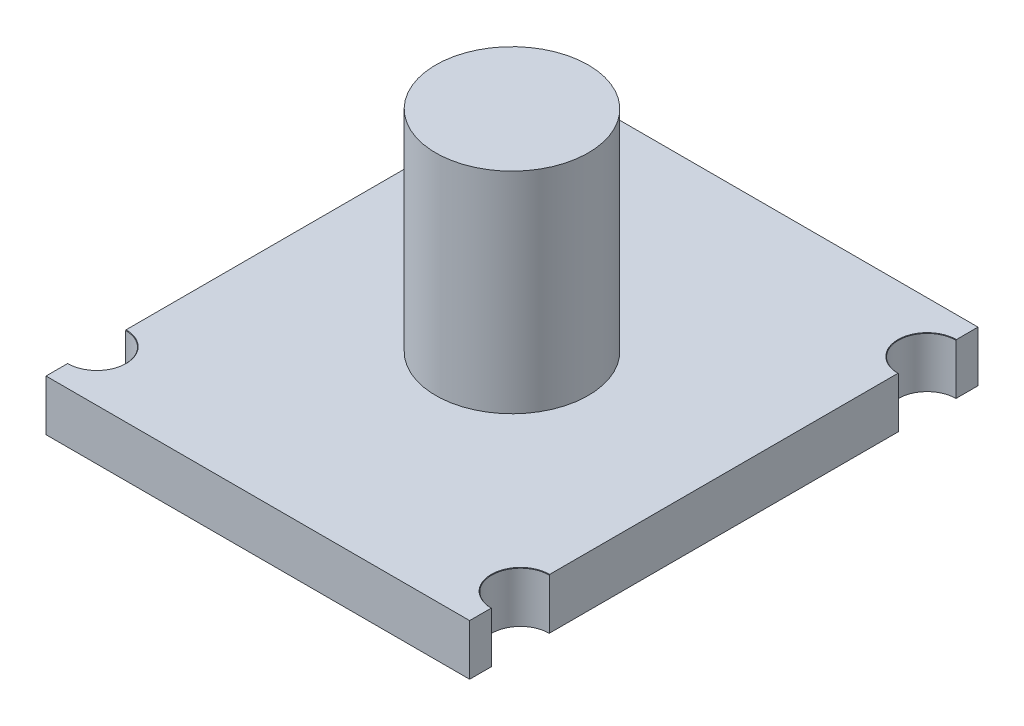
ISO-10303-21;
HEADER;
FILE_DESCRIPTION(('STEP AP214'),'2;1');
FILE_NAME('part.step','',(''),(''),'','','');
FILE_SCHEMA(('AUTOMOTIVE_DESIGN { 1 0 10303 214 1 1 1 1 }'));
ENDSEC;
DATA;
#1=APPLICATION_CONTEXT('core data for automotive mechanical design processes');
#2=APPLICATION_PROTOCOL_DEFINITION('international standard','automotive_design',2000,#1);
#3=PRODUCT_CONTEXT('',#1,'mechanical');
#4=PRODUCT('Part','Part','',(#3));
#5=PRODUCT_RELATED_PRODUCT_CATEGORY('part','',(#4));
#6=PRODUCT_DEFINITION_FORMATION('','',#4);
#7=PRODUCT_DEFINITION_CONTEXT('part definition',#1,'design');
#8=PRODUCT_DEFINITION('design','',#6,#7);
#9=PRODUCT_DEFINITION_SHAPE('','',#8);
#10=(LENGTH_UNIT() NAMED_UNIT(*) SI_UNIT(.MILLI.,.METRE.));
#11=(NAMED_UNIT(*) PLANE_ANGLE_UNIT() SI_UNIT($,.RADIAN.));
#12=(NAMED_UNIT(*) SI_UNIT($,.STERADIAN.) SOLID_ANGLE_UNIT());
#13=UNCERTAINTY_MEASURE_WITH_UNIT(LENGTH_MEASURE(1.E-05),#10,'distance_accuracy_value','');
#14=(GEOMETRIC_REPRESENTATION_CONTEXT(3) GLOBAL_UNCERTAINTY_ASSIGNED_CONTEXT((#13)) GLOBAL_UNIT_ASSIGNED_CONTEXT((#10,
#11,#12)) REPRESENTATION_CONTEXT('',''));
#15=CARTESIAN_POINT('',(0.,0.,0.));
#16=DIRECTION('',(0.,0.,1.));
#17=DIRECTION('',(1.,0.,0.));
#18=AXIS2_PLACEMENT_3D('',#15,#16,#17);
#19=CARTESIAN_POINT('',(0.,3.,0.));
#20=DIRECTION('',(1.,0.,0.));
#21=DIRECTION('',(0.,0.,-1.));
#22=AXIS2_PLACEMENT_3D('',#19,#20,#21);
#23=PLANE('',#22);
#24=DIRECTION('',(0.,0.,1.));
#25=VECTOR('',#24,1.);
#26=CARTESIAN_POINT('',(0.,0.,0.));
#27=LINE('',#26,#25);
#28=CARTESIAN_POINT('',(0.,0.,-25.3));
#29=VERTEX_POINT('',#28);
#30=CARTESIAN_POINT('',(0.,0.,-21.));
#31=VERTEX_POINT('',#30);
#32=EDGE_CURVE('E202',#29,#31,#27,.T.);
#33=ORIENTED_EDGE('',*,*,#32,.T.);
#34=DIRECTION('',(0.,1.,0.));
#35=VECTOR('',#34,1.);
#36=CARTESIAN_POINT('',(0.,-6.,-21.));
#37=LINE('',#36,#35);
#38=CARTESIAN_POINT('',(0.,-6.,-21.));
#39=VERTEX_POINT('',#38);
#40=EDGE_CURVE('E181',#39,#31,#37,.T.);
#41=ORIENTED_EDGE('',*,*,#40,.F.);
#42=DIRECTION('',(0.,0.,-1.));
#43=VECTOR('',#42,1.);
#44=CARTESIAN_POINT('',(0.,-6.,-9.));
#45=LINE('',#44,#43);
#46=CARTESIAN_POINT('',(0.,-6.,-9.));
#47=VERTEX_POINT('',#46);
#48=EDGE_CURVE('E188',#47,#39,#45,.T.);
#49=ORIENTED_EDGE('',*,*,#48,.F.);
#50=DIRECTION('',(0.,1.,0.));
#51=VECTOR('',#50,1.);
#52=CARTESIAN_POINT('',(0.,-6.,-9.));
#53=LINE('',#52,#51);
#54=CARTESIAN_POINT('',(0.,0.,-9.));
#55=VERTEX_POINT('',#54);
#56=EDGE_CURVE('E641',#47,#55,#53,.T.);
#57=ORIENTED_EDGE('',*,*,#56,.T.);
#58=CARTESIAN_POINT('',(0.,0.,-4.7));
#59=VERTEX_POINT('',#58);
#60=EDGE_CURVE('E61',#55,#59,#27,.T.);
#61=ORIENTED_EDGE('',*,*,#60,.T.);
#62=DIRECTION('',(0.,1.,0.));
#63=VECTOR('',#62,1.);
#64=CARTESIAN_POINT('',(0.,3.,-4.7));
#65=LINE('',#64,#63);
#66=CARTESIAN_POINT('',(0.,2.975,-4.7));
#67=VERTEX_POINT('',#66);
#68=EDGE_CURVE('E43',#59,#67,#65,.T.);
#69=ORIENTED_EDGE('',*,*,#68,.T.);
#70=DIRECTION('',(0.,0.707106781186563,-0.707106781186532));
#71=VECTOR('',#70,1.);
#72=CARTESIAN_POINT('',(0.,1.27499999999993,-3.));
#73=LINE('',#72,#71);
#74=CARTESIAN_POINT('',(0.,3.,-4.725));
#75=VERTEX_POINT('',#74);
#76=EDGE_CURVE('E363',#67,#75,#73,.T.);
#77=ORIENTED_EDGE('',*,*,#76,.T.);
#78=DIRECTION('',(0.,0.,1.));
#79=VECTOR('',#78,1.);
#80=CARTESIAN_POINT('',(0.,3.,0.));
#81=LINE('',#80,#79);
#82=CARTESIAN_POINT('',(0.,3.,-25.275));
#83=VERTEX_POINT('',#82);
#84=EDGE_CURVE('E266',#83,#75,#81,.T.);
#85=ORIENTED_EDGE('',*,*,#84,.F.);
#86=DIRECTION('',(0.,-0.707106781186563,-0.707106781186532));
#87=VECTOR('',#86,1.);
#88=CARTESIAN_POINT('',(0.,1.27499999999993,-27.));
#89=LINE('',#88,#87);
#90=CARTESIAN_POINT('',(0.,2.975,-25.3));
#91=VERTEX_POINT('',#90);
#92=EDGE_CURVE('E341',#83,#91,#89,.T.);
#93=ORIENTED_EDGE('',*,*,#92,.T.);
#94=DIRECTION('',(0.,1.,0.));
#95=VECTOR('',#94,1.);
#96=CARTESIAN_POINT('',(0.,3.,-25.3));
#97=LINE('',#96,#95);
#98=EDGE_CURVE('E345',#91,#29,#97,.F.);
#99=ORIENTED_EDGE('',*,*,#98,.T.);
#100=EDGE_LOOP('',(#33,#41,#49,#57,#61,#69,#77,#85,#93,#99));
#101=FACE_BOUND('',#100,.T.);
#102=ADVANCED_FACE('F39',(#101),#23,.F.);
#103=CARTESIAN_POINT('',(0.,3.,0.));
#104=DIRECTION('',(0.,-1.,0.));
#105=DIRECTION('',(0.,0.,-1.));
#106=AXIS2_PLACEMENT_3D('',#103,#104,#105);
#107=PLANE('',#106);
#108=CARTESIAN_POINT('',(12.5,3.,-15.));
#109=DIRECTION('',(0.,1.,0.));
#110=DIRECTION('',(0.,0.,1.));
#111=AXIS2_PLACEMENT_3D('',#108,#109,#110);
#112=CIRCLE('',#111,4.5);
#113=CARTESIAN_POINT('',(12.5,3.,-19.5));
#114=VERTEX_POINT('',#113);
#115=EDGE_CURVE('E11',#114,#114,#112,.T.);
#116=ORIENTED_EDGE('',*,*,#115,.F.);
#117=EDGE_LOOP('',(#116));
#118=FACE_BOUND('',#117,.T.);
#119=ORIENTED_EDGE('',*,*,#84,.T.);
#120=CARTESIAN_POINT('',(0.,3.,-3.));
#121=DIRECTION('',(0.,1.,0.));
#122=DIRECTION('',(0.,0.,1.));
#123=AXIS2_PLACEMENT_3D('',#120,#121,#122);
#124=CIRCLE('',#123,1.725);
#125=CARTESIAN_POINT('',(0.,3.,-1.275));
#126=VERTEX_POINT('',#125);
#127=EDGE_CURVE('E209',#126,#75,#124,.T.);
#128=ORIENTED_EDGE('',*,*,#127,.F.);
#129=CARTESIAN_POINT('',(0.,3.,0.));
#130=VERTEX_POINT('',#129);
#131=EDGE_CURVE('E267',#126,#130,#81,.T.);
#132=ORIENTED_EDGE('',*,*,#131,.T.);
#133=DIRECTION('',(1.,0.,0.));
#134=VECTOR('',#133,1.);
#135=CARTESIAN_POINT('',(0.,3.,0.));
#136=LINE('',#135,#134);
#137=CARTESIAN_POINT('',(25.,3.,0.));
#138=VERTEX_POINT('',#137);
#139=EDGE_CURVE('E265',#130,#138,#136,.T.);
#140=ORIENTED_EDGE('',*,*,#139,.T.);
#141=DIRECTION('',(0.,0.,-1.));
#142=VECTOR('',#141,1.);
#143=CARTESIAN_POINT('',(25.,3.,0.));
#144=LINE('',#143,#142);
#145=CARTESIAN_POINT('',(25.,3.,-1.275));
#146=VERTEX_POINT('',#145);
#147=EDGE_CURVE('E271',#138,#146,#144,.T.);
#148=ORIENTED_EDGE('',*,*,#147,.T.);
#149=CARTESIAN_POINT('',(25.,3.,-3.));
#150=DIRECTION('',(0.,1.,0.));
#151=DIRECTION('',(0.,0.,1.));
#152=AXIS2_PLACEMENT_3D('',#149,#150,#151);
#153=CIRCLE('',#152,1.725);
#154=CARTESIAN_POINT('',(25.,3.,-4.725));
#155=VERTEX_POINT('',#154);
#156=EDGE_CURVE('E235',#155,#146,#153,.T.);
#157=ORIENTED_EDGE('',*,*,#156,.F.);
#158=CARTESIAN_POINT('',(25.,3.,-25.275));
#159=VERTEX_POINT('',#158);
#160=EDGE_CURVE('E276',#155,#159,#144,.T.);
#161=ORIENTED_EDGE('',*,*,#160,.T.);
#162=CARTESIAN_POINT('',(25.,3.,-27.));
#163=DIRECTION('',(0.,1.,0.));
#164=DIRECTION('',(0.,0.,1.));
#165=AXIS2_PLACEMENT_3D('',#162,#163,#164);
#166=CIRCLE('',#165,1.725);
#167=CARTESIAN_POINT('',(25.,3.,-28.725));
#168=VERTEX_POINT('',#167);
#169=EDGE_CURVE('E246',#168,#159,#166,.T.);
#170=ORIENTED_EDGE('',*,*,#169,.F.);
#171=CARTESIAN_POINT('',(25.,3.,-30.));
#172=VERTEX_POINT('',#171);
#173=EDGE_CURVE('E270',#168,#172,#144,.T.);
#174=ORIENTED_EDGE('',*,*,#173,.T.);
#175=DIRECTION('',(-1.,0.,0.));
#176=VECTOR('',#175,1.);
#177=CARTESIAN_POINT('',(0.,3.,-30.));
#178=LINE('',#177,#176);
#179=CARTESIAN_POINT('',(0.,3.,-30.));
#180=VERTEX_POINT('',#179);
#181=EDGE_CURVE('E275',#172,#180,#178,.T.);
#182=ORIENTED_EDGE('',*,*,#181,.T.);
#183=CARTESIAN_POINT('',(0.,3.,-28.725));
#184=VERTEX_POINT('',#183);
#185=EDGE_CURVE('E261',#180,#184,#81,.T.);
#186=ORIENTED_EDGE('',*,*,#185,.T.);
#187=CARTESIAN_POINT('',(0.,3.,-27.));
#188=DIRECTION('',(0.,1.,0.));
#189=DIRECTION('',(0.,0.,1.));
#190=AXIS2_PLACEMENT_3D('',#187,#188,#189);
#191=CIRCLE('',#190,1.725);
#192=EDGE_CURVE('E224',#83,#184,#191,.T.);
#193=ORIENTED_EDGE('',*,*,#192,.F.);
#194=EDGE_LOOP('',(#119,#128,#132,#140,#148,#157,#161,#170,#174,#182,#186,#193));
#195=FACE_BOUND('',#194,.T.);
#196=ADVANCED_FACE('F393',(#118,#195),#107,.F.);
#197=CARTESIAN_POINT('',(0.,0.,-30.));
#198=VERTEX_POINT('',#197);
#199=CARTESIAN_POINT('',(0.,0.,-28.7));
#200=VERTEX_POINT('',#199);
#201=EDGE_CURVE('E280',#198,#200,#27,.T.);
#202=ORIENTED_EDGE('',*,*,#201,.T.);
#203=DIRECTION('',(0.,1.,0.));
#204=VECTOR('',#203,1.);
#205=CARTESIAN_POINT('',(0.,3.,-28.7));
#206=LINE('',#205,#204);
#207=CARTESIAN_POINT('',(0.,2.975,-28.7));
#208=VERTEX_POINT('',#207);
#209=EDGE_CURVE('E352',#200,#208,#206,.T.);
#210=ORIENTED_EDGE('',*,*,#209,.T.);
#211=DIRECTION('',(0.,0.707106781186563,-0.707106781186532));
#212=VECTOR('',#211,1.);
#213=CARTESIAN_POINT('',(0.,1.27499999999993,-27.));
#214=LINE('',#213,#212);
#215=EDGE_CURVE('E348',#208,#184,#214,.T.);
#216=ORIENTED_EDGE('',*,*,#215,.T.);
#217=ORIENTED_EDGE('',*,*,#185,.F.);
#218=DIRECTION('',(0.,-1.,0.));
#219=VECTOR('',#218,1.);
#220=CARTESIAN_POINT('',(0.,3.,-30.));
#221=LINE('',#220,#219);
#222=EDGE_CURVE('E279',#180,#198,#221,.T.);
#223=ORIENTED_EDGE('',*,*,#222,.T.);
#224=EDGE_LOOP('',(#202,#210,#216,#217,#223));
#225=FACE_BOUND('',#224,.T.);
#226=ADVANCED_FACE('F417',(#225),#23,.F.);
#227=CARTESIAN_POINT('',(25.,3.,0.));
#228=DIRECTION('',(-1.,0.,0.));
#229=DIRECTION('',(0.,0.,1.));
#230=AXIS2_PLACEMENT_3D('',#227,#228,#229);
#231=PLANE('',#230);
#232=DIRECTION('',(0.,1.,0.));
#233=VECTOR('',#232,1.);
#234=CARTESIAN_POINT('',(25.,3.,-1.3));
#235=LINE('',#234,#233);
#236=CARTESIAN_POINT('',(25.,0.,-1.3));
#237=VERTEX_POINT('',#236);
#238=CARTESIAN_POINT('',(25.,2.975,-1.3));
#239=VERTEX_POINT('',#238);
#240=EDGE_CURVE('E333',#237,#239,#235,.T.);
#241=ORIENTED_EDGE('',*,*,#240,.T.);
#242=DIRECTION('',(0.,0.707106781186566,0.707106781186529));
#243=VECTOR('',#242,1.);
#244=CARTESIAN_POINT('',(25.,1.27499999999991,-3.));
#245=LINE('',#244,#243);
#246=EDGE_CURVE('E337',#239,#146,#245,.T.);
#247=ORIENTED_EDGE('',*,*,#246,.T.);
#248=ORIENTED_EDGE('',*,*,#147,.F.);
#249=DIRECTION('',(0.,-1.,0.));
#250=VECTOR('',#249,1.);
#251=CARTESIAN_POINT('',(25.,3.,0.));
#252=LINE('',#251,#250);
#253=CARTESIAN_POINT('',(25.,0.,0.));
#254=VERTEX_POINT('',#253);
#255=EDGE_CURVE('E303',#138,#254,#252,.T.);
#256=ORIENTED_EDGE('',*,*,#255,.T.);
#257=DIRECTION('',(0.,0.,-1.));
#258=VECTOR('',#257,1.);
#259=CARTESIAN_POINT('',(25.,0.,0.));
#260=LINE('',#259,#258);
#261=EDGE_CURVE('E288',#254,#237,#260,.T.);
#262=ORIENTED_EDGE('',*,*,#261,.T.);
#263=EDGE_LOOP('',(#241,#247,#248,#256,#262));
#264=FACE_BOUND('',#263,.T.);
#265=ADVANCED_FACE('F432',(#264),#231,.F.);
#266=CARTESIAN_POINT('',(0.,0.,0.));
#267=DIRECTION('',(0.,-1.,0.));
#268=DIRECTION('',(0.,0.,-1.));
#269=AXIS2_PLACEMENT_3D('',#266,#267,#268);
#270=PLANE('',#269);
#271=DIRECTION('',(-1.,0.,0.));
#272=VECTOR('',#271,1.);
#273=CARTESIAN_POINT('',(0.,0.,-9.));
#274=LINE('',#273,#272);
#275=CARTESIAN_POINT('',(6.,0.,-9.));
#276=VERTEX_POINT('',#275);
#277=EDGE_CURVE('E56',#276,#55,#274,.T.);
#278=ORIENTED_EDGE('',*,*,#277,.F.);
#279=DIRECTION('',(0.,0.,1.));
#280=VECTOR('',#279,1.);
#281=CARTESIAN_POINT('',(6.,0.,-9.));
#282=LINE('',#281,#280);
#283=CARTESIAN_POINT('',(6.,0.,-21.));
#284=VERTEX_POINT('',#283);
#285=EDGE_CURVE('E644',#284,#276,#282,.T.);
#286=ORIENTED_EDGE('',*,*,#285,.F.);
#287=DIRECTION('',(1.,0.,0.));
#288=VECTOR('',#287,1.);
#289=CARTESIAN_POINT('',(0.,0.,-21.));
#290=LINE('',#289,#288);
#291=EDGE_CURVE('E654',#31,#284,#290,.T.);
#292=ORIENTED_EDGE('',*,*,#291,.F.);
#293=ORIENTED_EDGE('',*,*,#32,.F.);
#294=CARTESIAN_POINT('',(0.,0.,-27.));
#295=DIRECTION('',(0.,1.,0.));
#296=DIRECTION('',(0.,0.,1.));
#297=AXIS2_PLACEMENT_3D('',#294,#295,#296);
#298=CIRCLE('',#297,1.7);
#299=EDGE_CURVE('E231',#29,#200,#298,.T.);
#300=ORIENTED_EDGE('',*,*,#299,.T.);
#301=ORIENTED_EDGE('',*,*,#201,.F.);
#302=DIRECTION('',(-1.,0.,0.));
#303=VECTOR('',#302,1.);
#304=CARTESIAN_POINT('',(0.,0.,-30.));
#305=LINE('',#304,#303);
#306=CARTESIAN_POINT('',(25.,0.,-30.));
#307=VERTEX_POINT('',#306);
#308=EDGE_CURVE('E292',#307,#198,#305,.T.);
#309=ORIENTED_EDGE('',*,*,#308,.F.);
#310=CARTESIAN_POINT('',(25.,0.,-28.7));
#311=VERTEX_POINT('',#310);
#312=EDGE_CURVE('E287',#311,#307,#260,.T.);
#313=ORIENTED_EDGE('',*,*,#312,.F.);
#314=CARTESIAN_POINT('',(25.,0.,-27.));
#315=DIRECTION('',(0.,1.,0.));
#316=DIRECTION('',(0.,0.,1.));
#317=AXIS2_PLACEMENT_3D('',#314,#315,#316);
#318=CIRCLE('',#317,1.7);
#319=CARTESIAN_POINT('',(25.,0.,-25.3));
#320=VERTEX_POINT('',#319);
#321=EDGE_CURVE('E255',#311,#320,#318,.T.);
#322=ORIENTED_EDGE('',*,*,#321,.T.);
#323=CARTESIAN_POINT('',(25.,0.,-4.7));
#324=VERTEX_POINT('',#323);
#325=EDGE_CURVE('E293',#324,#320,#260,.T.);
#326=ORIENTED_EDGE('',*,*,#325,.F.);
#327=CARTESIAN_POINT('',(25.,0.,-3.));
#328=DIRECTION('',(0.,1.,0.));
#329=DIRECTION('',(0.,0.,1.));
#330=AXIS2_PLACEMENT_3D('',#327,#328,#329);
#331=CIRCLE('',#330,1.7);
#332=EDGE_CURVE('E242',#324,#237,#331,.T.);
#333=ORIENTED_EDGE('',*,*,#332,.T.);
#334=ORIENTED_EDGE('',*,*,#261,.F.);
#335=DIRECTION('',(1.,0.,0.));
#336=VECTOR('',#335,1.);
#337=CARTESIAN_POINT('',(0.,0.,0.));
#338=LINE('',#337,#336);
#339=CARTESIAN_POINT('',(0.,0.,0.));
#340=VERTEX_POINT('',#339);
#341=EDGE_CURVE('E284',#340,#254,#338,.T.);
#342=ORIENTED_EDGE('',*,*,#341,.F.);
#343=CARTESIAN_POINT('',(0.,0.,-1.3));
#344=VERTEX_POINT('',#343);
#345=EDGE_CURVE('E254',#344,#340,#27,.T.);
#346=ORIENTED_EDGE('',*,*,#345,.F.);
#347=CARTESIAN_POINT('',(0.,0.,-3.));
#348=DIRECTION('',(0.,1.,0.));
#349=DIRECTION('',(0.,0.,1.));
#350=AXIS2_PLACEMENT_3D('',#347,#348,#349);
#351=CIRCLE('',#350,1.7);
#352=EDGE_CURVE('E221',#344,#59,#351,.T.);
#353=ORIENTED_EDGE('',*,*,#352,.T.);
#354=ORIENTED_EDGE('',*,*,#60,.F.);
#355=EDGE_LOOP('',(#278,#286,#292,#293,#300,#301,#309,#313,#322,#326,#333,#334,#342,#346,#353,#354));
#356=FACE_BOUND('',#355,.T.);
#357=ADVANCED_FACE('F375',(#356),#270,.T.);
#358=DIRECTION('',(0.,-0.707106781186566,0.707106781186529));
#359=VECTOR('',#358,1.);
#360=CARTESIAN_POINT('',(25.,1.27499999999991,-3.));
#361=LINE('',#360,#359);
#362=CARTESIAN_POINT('',(25.,2.975,-4.7));
#363=VERTEX_POINT('',#362);
#364=EDGE_CURVE('E259',#155,#363,#361,.T.);
#365=ORIENTED_EDGE('',*,*,#364,.T.);
#366=DIRECTION('',(0.,1.,0.));
#367=VECTOR('',#366,1.);
#368=CARTESIAN_POINT('',(25.,3.,-4.7));
#369=LINE('',#368,#367);
#370=EDGE_CURVE('E329',#363,#324,#369,.F.);
#371=ORIENTED_EDGE('',*,*,#370,.T.);
#372=ORIENTED_EDGE('',*,*,#325,.T.);
#373=DIRECTION('',(0.,1.,0.));
#374=VECTOR('',#373,1.);
#375=CARTESIAN_POINT('',(25.,3.,-25.3));
#376=LINE('',#375,#374);
#377=CARTESIAN_POINT('',(25.,2.975,-25.3));
#378=VERTEX_POINT('',#377);
#379=EDGE_CURVE('E260',#320,#378,#376,.T.);
#380=ORIENTED_EDGE('',*,*,#379,.T.);
#381=DIRECTION('',(0.,0.707106781186566,0.707106781186529));
#382=VECTOR('',#381,1.);
#383=CARTESIAN_POINT('',(25.,1.27499999999991,-27.));
#384=LINE('',#383,#382);
#385=EDGE_CURVE('E319',#378,#159,#384,.T.);
#386=ORIENTED_EDGE('',*,*,#385,.T.);
#387=ORIENTED_EDGE('',*,*,#160,.F.);
#388=EDGE_LOOP('',(#365,#371,#372,#380,#386,#387));
#389=FACE_BOUND('',#388,.T.);
#390=ADVANCED_FACE('F398',(#389),#231,.F.);
#391=DIRECTION('',(0.,-0.707106781186563,-0.707106781186532));
#392=VECTOR('',#391,1.);
#393=CARTESIAN_POINT('',(0.,1.27499999999993,-3.));
#394=LINE('',#393,#392);
#395=CARTESIAN_POINT('',(0.,2.975,-1.3));
#396=VERTEX_POINT('',#395);
#397=EDGE_CURVE('E356',#126,#396,#394,.T.);
#398=ORIENTED_EDGE('',*,*,#397,.T.);
#399=DIRECTION('',(0.,1.,0.));
#400=VECTOR('',#399,1.);
#401=CARTESIAN_POINT('',(0.,3.,-1.3));
#402=LINE('',#401,#400);
#403=EDGE_CURVE('E360',#396,#344,#402,.F.);
#404=ORIENTED_EDGE('',*,*,#403,.T.);
#405=ORIENTED_EDGE('',*,*,#345,.T.);
#406=DIRECTION('',(0.,-1.,0.));
#407=VECTOR('',#406,1.);
#408=CARTESIAN_POINT('',(0.,3.,0.));
#409=LINE('',#408,#407);
#410=EDGE_CURVE('E307',#130,#340,#409,.T.);
#411=ORIENTED_EDGE('',*,*,#410,.F.);
#412=ORIENTED_EDGE('',*,*,#131,.F.);
#413=EDGE_LOOP('',(#398,#404,#405,#411,#412));
#414=FACE_BOUND('',#413,.T.);
#415=ADVANCED_FACE('F41',(#414),#23,.F.);
#416=CARTESIAN_POINT('',(0.,3.,0.));
#417=DIRECTION('',(0.,0.,-1.));
#418=DIRECTION('',(-1.,0.,0.));
#419=AXIS2_PLACEMENT_3D('',#416,#417,#418);
#420=PLANE('',#419);
#421=ORIENTED_EDGE('',*,*,#341,.T.);
#422=ORIENTED_EDGE('',*,*,#255,.F.);
#423=ORIENTED_EDGE('',*,*,#139,.F.);
#424=ORIENTED_EDGE('',*,*,#410,.T.);
#425=EDGE_LOOP('',(#421,#422,#423,#424));
#426=FACE_BOUND('',#425,.T.);
#427=ADVANCED_FACE('F428',(#426),#420,.F.);
#428=DIRECTION('',(0.,-0.707106781186566,0.707106781186529));
#429=VECTOR('',#428,1.);
#430=CARTESIAN_POINT('',(25.,1.27499999999991,-27.));
#431=LINE('',#430,#429);
#432=CARTESIAN_POINT('',(25.,2.975,-28.7));
#433=VERTEX_POINT('',#432);
#434=EDGE_CURVE('E311',#168,#433,#431,.T.);
#435=ORIENTED_EDGE('',*,*,#434,.T.);
#436=DIRECTION('',(0.,1.,0.));
#437=VECTOR('',#436,1.);
#438=CARTESIAN_POINT('',(25.,3.,-28.7));
#439=LINE('',#438,#437);
#440=EDGE_CURVE('E315',#433,#311,#439,.F.);
#441=ORIENTED_EDGE('',*,*,#440,.T.);
#442=ORIENTED_EDGE('',*,*,#312,.T.);
#443=DIRECTION('',(0.,-1.,0.));
#444=VECTOR('',#443,1.);
#445=CARTESIAN_POINT('',(25.,3.,-30.));
#446=LINE('',#445,#444);
#447=EDGE_CURVE('E299',#172,#307,#446,.T.);
#448=ORIENTED_EDGE('',*,*,#447,.F.);
#449=ORIENTED_EDGE('',*,*,#173,.F.);
#450=EDGE_LOOP('',(#435,#441,#442,#448,#449));
#451=FACE_BOUND('',#450,.T.);
#452=ADVANCED_FACE('F409',(#451),#231,.F.);
#453=CARTESIAN_POINT('',(0.,3.,-30.));
#454=DIRECTION('',(0.,0.,1.));
#455=DIRECTION('',(1.,0.,0.));
#456=AXIS2_PLACEMENT_3D('',#453,#454,#455);
#457=PLANE('',#456);
#458=ORIENTED_EDGE('',*,*,#308,.T.);
#459=ORIENTED_EDGE('',*,*,#222,.F.);
#460=ORIENTED_EDGE('',*,*,#181,.F.);
#461=ORIENTED_EDGE('',*,*,#447,.T.);
#462=EDGE_LOOP('',(#458,#459,#460,#461));
#463=FACE_BOUND('',#462,.T.);
#464=ADVANCED_FACE('F412',(#463),#457,.F.);
#465=CARTESIAN_POINT('',(25.,3.,-27.));
#466=DIRECTION('',(0.,1.,0.));
#467=DIRECTION('',(0.,0.,1.));
#468=AXIS2_PLACEMENT_3D('',#465,#466,#467);
#469=CYLINDRICAL_SURFACE('',#468,1.7);
#470=ORIENTED_EDGE('',*,*,#321,.F.);
#471=ORIENTED_EDGE('',*,*,#440,.F.);
#472=CARTESIAN_POINT('',(25.,2.975,-27.));
#473=DIRECTION('',(0.,1.,0.));
#474=DIRECTION('',(0.,0.,1.));
#475=AXIS2_PLACEMENT_3D('',#472,#473,#474);
#476=CIRCLE('',#475,1.7);
#477=EDGE_CURVE('E250',#433,#378,#476,.T.);
#478=ORIENTED_EDGE('',*,*,#477,.T.);
#479=ORIENTED_EDGE('',*,*,#379,.F.);
#480=EDGE_LOOP('',(#470,#471,#478,#479));
#481=FACE_BOUND('',#480,.T.);
#482=ADVANCED_FACE('F402',(#481),#469,.F.);
#483=CARTESIAN_POINT('',(25.,3.,-27.));
#484=DIRECTION('',(0.,1.,0.));
#485=DIRECTION('',(0.,0.,1.));
#486=AXIS2_PLACEMENT_3D('',#483,#484,#485);
#487=CONICAL_SURFACE('',#486,1.725,0.785398163397422);
#488=ORIENTED_EDGE('',*,*,#477,.F.);
#489=ORIENTED_EDGE('',*,*,#434,.F.);
#490=ORIENTED_EDGE('',*,*,#169,.T.);
#491=ORIENTED_EDGE('',*,*,#385,.F.);
#492=EDGE_LOOP('',(#488,#489,#490,#491));
#493=FACE_BOUND('',#492,.T.);
#494=ADVANCED_FACE('F397',(#493),#487,.F.);
#495=CARTESIAN_POINT('',(25.,3.,-3.));
#496=DIRECTION('',(0.,1.,0.));
#497=DIRECTION('',(0.,0.,1.));
#498=AXIS2_PLACEMENT_3D('',#495,#496,#497);
#499=CYLINDRICAL_SURFACE('',#498,1.7);
#500=ORIENTED_EDGE('',*,*,#332,.F.);
#501=ORIENTED_EDGE('',*,*,#370,.F.);
#502=CARTESIAN_POINT('',(25.,2.975,-3.));
#503=DIRECTION('',(0.,1.,0.));
#504=DIRECTION('',(0.,0.,1.));
#505=AXIS2_PLACEMENT_3D('',#502,#503,#504);
#506=CIRCLE('',#505,1.7);
#507=EDGE_CURVE('E238',#363,#239,#506,.T.);
#508=ORIENTED_EDGE('',*,*,#507,.T.);
#509=ORIENTED_EDGE('',*,*,#240,.F.);
#510=EDGE_LOOP('',(#500,#501,#508,#509));
#511=FACE_BOUND('',#510,.T.);
#512=ADVANCED_FACE('F437',(#511),#499,.F.);
#513=CARTESIAN_POINT('',(25.,3.,-3.));
#514=DIRECTION('',(0.,1.,0.));
#515=DIRECTION('',(0.,0.,1.));
#516=AXIS2_PLACEMENT_3D('',#513,#514,#515);
#517=CONICAL_SURFACE('',#516,1.725,0.785398163397422);
#518=ORIENTED_EDGE('',*,*,#507,.F.);
#519=ORIENTED_EDGE('',*,*,#364,.F.);
#520=ORIENTED_EDGE('',*,*,#156,.T.);
#521=ORIENTED_EDGE('',*,*,#246,.F.);
#522=EDGE_LOOP('',(#518,#519,#520,#521));
#523=FACE_BOUND('',#522,.T.);
#524=ADVANCED_FACE('F434',(#523),#517,.F.);
#525=CARTESIAN_POINT('',(0.,3.,-27.));
#526=DIRECTION('',(0.,1.,0.));
#527=DIRECTION('',(0.,0.,1.));
#528=AXIS2_PLACEMENT_3D('',#525,#526,#527);
#529=CYLINDRICAL_SURFACE('',#528,1.7);
#530=ORIENTED_EDGE('',*,*,#299,.F.);
#531=ORIENTED_EDGE('',*,*,#98,.F.);
#532=CARTESIAN_POINT('',(0.,2.975,-27.));
#533=DIRECTION('',(0.,1.,0.));
#534=DIRECTION('',(0.,0.,1.));
#535=AXIS2_PLACEMENT_3D('',#532,#533,#534);
#536=CIRCLE('',#535,1.7);
#537=EDGE_CURVE('E227',#91,#208,#536,.T.);
#538=ORIENTED_EDGE('',*,*,#537,.T.);
#539=ORIENTED_EDGE('',*,*,#209,.F.);
#540=EDGE_LOOP('',(#530,#531,#538,#539));
#541=FACE_BOUND('',#540,.T.);
#542=ADVANCED_FACE('F422',(#541),#529,.F.);
#543=CARTESIAN_POINT('',(0.,3.,-27.));
#544=DIRECTION('',(0.,1.,0.));
#545=DIRECTION('',(0.,0.,1.));
#546=AXIS2_PLACEMENT_3D('',#543,#544,#545);
#547=CONICAL_SURFACE('',#546,1.725,0.785398163397427);
#548=ORIENTED_EDGE('',*,*,#537,.F.);
#549=ORIENTED_EDGE('',*,*,#92,.F.);
#550=ORIENTED_EDGE('',*,*,#192,.T.);
#551=ORIENTED_EDGE('',*,*,#215,.F.);
#552=EDGE_LOOP('',(#548,#549,#550,#551));
#553=FACE_BOUND('',#552,.T.);
#554=ADVANCED_FACE('F419',(#553),#547,.F.);
#555=CARTESIAN_POINT('',(0.,3.,-3.));
#556=DIRECTION('',(0.,1.,0.));
#557=DIRECTION('',(0.,0.,1.));
#558=AXIS2_PLACEMENT_3D('',#555,#556,#557);
#559=CYLINDRICAL_SURFACE('',#558,1.7);
#560=ORIENTED_EDGE('',*,*,#352,.F.);
#561=ORIENTED_EDGE('',*,*,#403,.F.);
#562=CARTESIAN_POINT('',(0.,2.975,-3.));
#563=DIRECTION('',(0.,1.,0.));
#564=DIRECTION('',(0.,0.,1.));
#565=AXIS2_PLACEMENT_3D('',#562,#563,#564);
#566=CIRCLE('',#565,1.7);
#567=EDGE_CURVE('E217',#396,#67,#566,.T.);
#568=ORIENTED_EDGE('',*,*,#567,.T.);
#569=ORIENTED_EDGE('',*,*,#68,.F.);
#570=EDGE_LOOP('',(#560,#561,#568,#569));
#571=FACE_BOUND('',#570,.T.);
#572=ADVANCED_FACE('F372',(#571),#559,.F.);
#573=CARTESIAN_POINT('',(0.,3.,-3.));
#574=DIRECTION('',(0.,1.,0.));
#575=DIRECTION('',(0.,0.,1.));
#576=AXIS2_PLACEMENT_3D('',#573,#574,#575);
#577=CONICAL_SURFACE('',#576,1.725,0.785398163397427);
#578=ORIENTED_EDGE('',*,*,#567,.F.);
#579=ORIENTED_EDGE('',*,*,#397,.F.);
#580=ORIENTED_EDGE('',*,*,#127,.T.);
#581=ORIENTED_EDGE('',*,*,#76,.F.);
#582=EDGE_LOOP('',(#578,#579,#580,#581));
#583=FACE_BOUND('',#582,.T.);
#584=ADVANCED_FACE('F528',(#583),#577,.F.);
#585=CARTESIAN_POINT('',(12.5,15.4,-15.));
#586=DIRECTION('',(0.,-1.,0.));
#587=DIRECTION('',(0.,0.,-1.));
#588=AXIS2_PLACEMENT_3D('',#585,#586,#587);
#589=CYLINDRICAL_SURFACE('',#588,4.5);
#590=CARTESIAN_POINT('',(12.5,15.4,-15.));
#591=DIRECTION('',(0.,1.,0.));
#592=DIRECTION('',(0.,0.,1.));
#593=AXIS2_PLACEMENT_3D('',#590,#591,#592);
#594=CIRCLE('',#593,4.5);
#595=CARTESIAN_POINT('',(12.5,15.4,-19.5));
#596=VERTEX_POINT('',#595);
#597=EDGE_CURVE('E204',#596,#596,#594,.T.);
#598=CARTESIAN_POINT('',(12.5,15.4,-19.5));
#599=CARTESIAN_POINT('',(12.5,15.2708333333333,-19.5));
#600=CARTESIAN_POINT('',(12.5,15.1416666666667,-19.5));
#601=CARTESIAN_POINT('',(12.5,14.8833333333333,-19.5));
#602=CARTESIAN_POINT('',(12.5,14.7541666666667,-19.5));
#603=CARTESIAN_POINT('',(12.5,14.4958333333333,-19.5));
#604=CARTESIAN_POINT('',(12.5,14.3666666666667,-19.5));
#605=CARTESIAN_POINT('',(12.5,14.1083333333333,-19.5));
#606=CARTESIAN_POINT('',(12.5,13.9791666666667,-19.5));
#607=CARTESIAN_POINT('',(12.5,13.7208333333333,-19.5));
#608=CARTESIAN_POINT('',(12.5,13.5916666666667,-19.5));
#609=CARTESIAN_POINT('',(12.5,13.3333333333333,-19.5));
#610=CARTESIAN_POINT('',(12.5,13.2041666666667,-19.5));
#611=CARTESIAN_POINT('',(12.5,12.9458333333333,-19.5));
#612=CARTESIAN_POINT('',(12.5,12.8166666666667,-19.5));
#613=CARTESIAN_POINT('',(12.5,12.5583333333333,-19.5));
#614=CARTESIAN_POINT('',(12.5,12.4291666666667,-19.5));
#615=CARTESIAN_POINT('',(12.5,12.1708333333333,-19.5));
#616=CARTESIAN_POINT('',(12.5,12.0416666666667,-19.5));
#617=CARTESIAN_POINT('',(12.5,11.7833333333333,-19.5));
#618=CARTESIAN_POINT('',(12.5,11.6541666666667,-19.5));
#619=CARTESIAN_POINT('',(12.5,11.3958333333333,-19.5));
#620=CARTESIAN_POINT('',(12.5,11.2666666666667,-19.5));
#621=CARTESIAN_POINT('',(12.5,11.0083333333333,-19.5));
#622=CARTESIAN_POINT('',(12.5,10.8791666666667,-19.5));
#623=CARTESIAN_POINT('',(12.5,10.6208333333333,-19.5));
#624=CARTESIAN_POINT('',(12.5,10.4916666666667,-19.5));
#625=CARTESIAN_POINT('',(12.5,10.2333333333333,-19.5));
#626=CARTESIAN_POINT('',(12.5,10.1041666666667,-19.5));
#627=CARTESIAN_POINT('',(12.5,9.84583333333333,-19.5));
#628=CARTESIAN_POINT('',(12.5,9.71666666666667,-19.5));
#629=CARTESIAN_POINT('',(12.5,9.45833333333333,-19.5));
#630=CARTESIAN_POINT('',(12.5,9.32916666666667,-19.5));
#631=CARTESIAN_POINT('',(12.5,9.07083333333333,-19.5));
#632=CARTESIAN_POINT('',(12.5,8.94166666666667,-19.5));
#633=CARTESIAN_POINT('',(12.5,8.68333333333334,-19.5));
#634=CARTESIAN_POINT('',(12.5,8.55416666666667,-19.5));
#635=CARTESIAN_POINT('',(12.5,8.29583333333333,-19.5));
#636=CARTESIAN_POINT('',(12.5,8.16666666666667,-19.5));
#637=CARTESIAN_POINT('',(12.5,7.90833333333333,-19.5));
#638=CARTESIAN_POINT('',(12.5,7.77916666666667,-19.5));
#639=CARTESIAN_POINT('',(12.5,7.52083333333333,-19.5));
#640=CARTESIAN_POINT('',(12.5,7.39166666666667,-19.5));
#641=CARTESIAN_POINT('',(12.5,7.13333333333333,-19.5));
#642=CARTESIAN_POINT('',(12.5,7.00416666666667,-19.5));
#643=CARTESIAN_POINT('',(12.5,6.74583333333333,-19.5));
#644=CARTESIAN_POINT('',(12.5,6.61666666666667,-19.5));
#645=CARTESIAN_POINT('',(12.5,6.35833333333334,-19.5));
#646=CARTESIAN_POINT('',(12.5,6.22916666666667,-19.5));
#647=CARTESIAN_POINT('',(12.5,5.97083333333333,-19.5));
#648=CARTESIAN_POINT('',(12.5,5.84166666666667,-19.5));
#649=CARTESIAN_POINT('',(12.5,5.58333333333333,-19.5));
#650=CARTESIAN_POINT('',(12.5,5.45416666666667,-19.5));
#651=CARTESIAN_POINT('',(12.5,5.19583333333333,-19.5));
#652=CARTESIAN_POINT('',(12.5,5.06666666666667,-19.5));
#653=CARTESIAN_POINT('',(12.5,4.80833333333333,-19.5));
#654=CARTESIAN_POINT('',(12.5,4.67916666666667,-19.5));
#655=CARTESIAN_POINT('',(12.5,4.42083333333333,-19.5));
#656=CARTESIAN_POINT('',(12.5,4.29166666666667,-19.5));
#657=CARTESIAN_POINT('',(12.5,4.03333333333333,-19.5));
#658=CARTESIAN_POINT('',(12.5,3.90416666666667,-19.5));
#659=CARTESIAN_POINT('',(12.5,3.64583333333333,-19.5));
#660=CARTESIAN_POINT('',(12.5,3.51666666666667,-19.5));
#661=CARTESIAN_POINT('',(12.5,3.25833333333334,-19.5));
#662=CARTESIAN_POINT('',(12.5,3.12916666666667,-19.5));
#663=CARTESIAN_POINT('',(12.5,3.,-19.5));
#664=B_SPLINE_CURVE_WITH_KNOTS('',3,(#598,#599,#600,#601,#602,#603,#604,#605,#606,#607,#608,
#609,#610,#611,#612,#613,#614,#615,#616,#617,#618,#619,#620,#621,#622,#623,#624,#625,#626,#627,
#628,#629,#630,#631,#632,#633,#634,#635,#636,#637,#638,#639,#640,#641,#642,#643,#644,#645,#646,
#647,#648,#649,#650,#651,#652,#653,#654,#655,#656,#657,#658,#659,#660,#661,#662,#663),
.UNSPECIFIED.,.F.,.F.,(4,2,2,2,2,2,2,2,2,2,2,2,2,2,2,2,2,2,2,2,2,2,2,2,2,2,2,2,2,2,2,2,4),(0.,
0.387500000000001,0.775000000000001,1.1625,1.55,1.9375,2.325,2.7125,3.1,3.4875,3.875,4.2625,
4.65,5.0375,5.425,5.8125,6.2,6.5875,6.975,7.3625,7.75,8.1375,8.525,8.9125,9.3,9.6875,10.075,
10.4625,10.85,11.2375,11.625,12.0125,12.4),.UNSPECIFIED.);
#665=EDGE_CURVE('BSEAM525',#596,#114,#664,.T.);
#666=ORIENTED_EDGE('',*,*,#597,.F.);
#667=ORIENTED_EDGE('',*,*,#115,.T.);
#668=ORIENTED_EDGE('',*,*,#665,.T.);
#669=ORIENTED_EDGE('',*,*,#665,.F.);
#670=EDGE_LOOP('',(#666,#668,#667,#669));
#671=FACE_BOUND('',#670,.T.);
#672=ADVANCED_FACE('F525',(#671),#589,.T.);
#673=CARTESIAN_POINT('',(12.5,15.4,-15.));
#674=DIRECTION('',(0.,1.,0.));
#675=DIRECTION('',(0.,0.,1.));
#676=AXIS2_PLACEMENT_3D('',#673,#674,#675);
#677=PLANE('',#676);
#678=ORIENTED_EDGE('',*,*,#597,.T.);
#679=EDGE_LOOP('',(#678));
#680=FACE_BOUND('',#679,.T.);
#681=ADVANCED_FACE('F491',(#680),#677,.T.);
#682=CARTESIAN_POINT('',(0.,-6.,-21.));
#683=DIRECTION('',(0.,0.,1.));
#684=DIRECTION('',(1.,0.,0.));
#685=AXIS2_PLACEMENT_3D('',#682,#683,#684);
#686=PLANE('',#685);
#687=ORIENTED_EDGE('',*,*,#291,.T.);
#688=DIRECTION('',(0.,1.,0.));
#689=VECTOR('',#688,1.);
#690=CARTESIAN_POINT('',(6.,-6.,-21.));
#691=LINE('',#690,#689);
#692=CARTESIAN_POINT('',(6.,-6.,-21.));
#693=VERTEX_POINT('',#692);
#694=EDGE_CURVE('E183',#693,#284,#691,.T.);
#695=ORIENTED_EDGE('',*,*,#694,.F.);
#696=DIRECTION('',(1.,0.,0.));
#697=VECTOR('',#696,1.);
#698=CARTESIAN_POINT('',(0.,-6.,-21.));
#699=LINE('',#698,#697);
#700=EDGE_CURVE('E176',#39,#693,#699,.T.);
#701=ORIENTED_EDGE('',*,*,#700,.F.);
#702=ORIENTED_EDGE('',*,*,#40,.T.);
#703=EDGE_LOOP('',(#687,#695,#701,#702));
#704=FACE_BOUND('',#703,.T.);
#705=ADVANCED_FACE('F179',(#704),#686,.F.);
#706=CARTESIAN_POINT('',(6.,-6.,-9.));
#707=DIRECTION('',(-1.,0.,0.));
#708=DIRECTION('',(0.,0.,1.));
#709=AXIS2_PLACEMENT_3D('',#706,#707,#708);
#710=PLANE('',#709);
#711=ORIENTED_EDGE('',*,*,#285,.T.);
#712=DIRECTION('',(0.,1.,0.));
#713=VECTOR('',#712,1.);
#714=CARTESIAN_POINT('',(6.,-6.,-9.));
#715=LINE('',#714,#713);
#716=CARTESIAN_POINT('',(6.,-6.,-9.));
#717=VERTEX_POINT('',#716);
#718=EDGE_CURVE('E211',#717,#276,#715,.T.);
#719=ORIENTED_EDGE('',*,*,#718,.F.);
#720=DIRECTION('',(0.,0.,1.));
#721=VECTOR('',#720,1.);
#722=CARTESIAN_POINT('',(6.,-6.,-9.));
#723=LINE('',#722,#721);
#724=EDGE_CURVE('E187',#693,#717,#723,.T.);
#725=ORIENTED_EDGE('',*,*,#724,.F.);
#726=ORIENTED_EDGE('',*,*,#694,.T.);
#727=EDGE_LOOP('',(#711,#719,#725,#726));
#728=FACE_BOUND('',#727,.T.);
#729=ADVANCED_FACE('F490',(#728),#710,.F.);
#730=CARTESIAN_POINT('',(0.,-6.,-9.));
#731=DIRECTION('',(0.,0.,-1.));
#732=DIRECTION('',(-1.,0.,0.));
#733=AXIS2_PLACEMENT_3D('',#730,#731,#732);
#734=PLANE('',#733);
#735=ORIENTED_EDGE('',*,*,#277,.T.);
#736=ORIENTED_EDGE('',*,*,#56,.F.);
#737=DIRECTION('',(-1.,0.,0.));
#738=VECTOR('',#737,1.);
#739=CARTESIAN_POINT('',(0.,-6.,-9.));
#740=LINE('',#739,#738);
#741=EDGE_CURVE('E193',#717,#47,#740,.T.);
#742=ORIENTED_EDGE('',*,*,#741,.F.);
#743=ORIENTED_EDGE('',*,*,#718,.T.);
#744=EDGE_LOOP('',(#735,#736,#742,#743));
#745=FACE_BOUND('',#744,.T.);
#746=ADVANCED_FACE('F501',(#745),#734,.F.);
#747=CARTESIAN_POINT('',(0.,-6.,0.));
#748=DIRECTION('',(0.,-1.,0.));
#749=DIRECTION('',(0.,0.,-1.));
#750=AXIS2_PLACEMENT_3D('',#747,#748,#749);
#751=PLANE('',#750);
#752=ORIENTED_EDGE('',*,*,#48,.T.);
#753=ORIENTED_EDGE('',*,*,#700,.T.);
#754=ORIENTED_EDGE('',*,*,#724,.T.);
#755=ORIENTED_EDGE('',*,*,#741,.T.);
#756=EDGE_LOOP('',(#752,#753,#754,#755));
#757=FACE_BOUND('',#756,.T.);
#758=ADVANCED_FACE('F191',(#757),#751,.T.);
#759=CLOSED_SHELL('',(#102,#196,#226,#265,#357,#390,#415,#427,#452,#464,#482,#494,#512,#524,
#542,#554,#572,#584,#672,#681,#705,#729,#746,#758));
#760=MANIFOLD_SOLID_BREP('B2',#759);
#761=ADVANCED_BREP_SHAPE_REPRESENTATION('',(#18,#760),#14);
#762=SHAPE_DEFINITION_REPRESENTATION(#9,#761);
ENDSEC;
END-ISO-10303-21;
